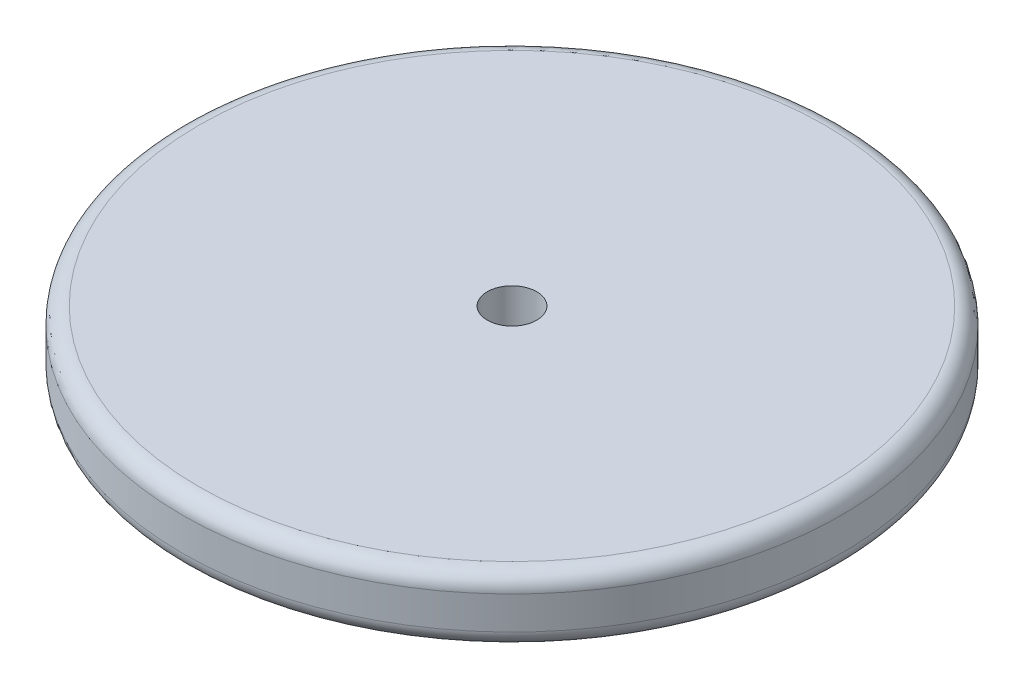
ISO-10303-21;
HEADER;
FILE_DESCRIPTION(('STEP AP214'),'2;1');
FILE_NAME('part.step','',(''),(''),'','','');
FILE_SCHEMA(('AUTOMOTIVE_DESIGN { 1 0 10303 214 1 1 1 1 }'));
ENDSEC;
DATA;
#1=APPLICATION_CONTEXT('core data for automotive mechanical design processes');
#2=APPLICATION_PROTOCOL_DEFINITION('international standard','automotive_design',2000,#1);
#3=PRODUCT_CONTEXT('',#1,'mechanical');
#4=PRODUCT('Part','Part','',(#3));
#5=PRODUCT_RELATED_PRODUCT_CATEGORY('part','',(#4));
#6=PRODUCT_DEFINITION_FORMATION('','',#4);
#7=PRODUCT_DEFINITION_CONTEXT('part definition',#1,'design');
#8=PRODUCT_DEFINITION('design','',#6,#7);
#9=PRODUCT_DEFINITION_SHAPE('','',#8);
#10=(LENGTH_UNIT() NAMED_UNIT(*) SI_UNIT(.MILLI.,.METRE.));
#11=(NAMED_UNIT(*) PLANE_ANGLE_UNIT() SI_UNIT($,.RADIAN.));
#12=(NAMED_UNIT(*) SI_UNIT($,.STERADIAN.) SOLID_ANGLE_UNIT());
#13=UNCERTAINTY_MEASURE_WITH_UNIT(LENGTH_MEASURE(1.E-05),#10,'distance_accuracy_value','');
#14=(GEOMETRIC_REPRESENTATION_CONTEXT(3) GLOBAL_UNCERTAINTY_ASSIGNED_CONTEXT((#13)) GLOBAL_UNIT_ASSIGNED_CONTEXT((#10,
#11,#12)) REPRESENTATION_CONTEXT('',''));
#15=CARTESIAN_POINT('',(0.,0.,0.));
#16=DIRECTION('',(0.,0.,1.));
#17=DIRECTION('',(1.,0.,0.));
#18=AXIS2_PLACEMENT_3D('',#15,#16,#17);
#19=CARTESIAN_POINT('',(0.,20.,0.));
#20=DIRECTION('',(0.,1.,0.));
#21=DIRECTION('',(0.,0.,1.));
#22=AXIS2_PLACEMENT_3D('',#19,#20,#21);
#23=PLANE('',#22);
#24=CARTESIAN_POINT('',(0.,20.,0.));
#25=DIRECTION('',(0.,1.,0.));
#26=DIRECTION('',(0.,0.,1.));
#27=AXIS2_PLACEMENT_3D('',#24,#25,#26);
#28=CIRCLE('',#27,95.);
#29=CARTESIAN_POINT('',(0.,20.,95.));
#30=VERTEX_POINT('',#29);
#31=EDGE_CURVE('E10',#30,#30,#28,.T.);
#32=ORIENTED_EDGE('',*,*,#31,.T.);
#33=EDGE_LOOP('',(#32));
#34=FACE_BOUND('',#33,.T.);
#35=CARTESIAN_POINT('',(0.,20.,0.));
#36=DIRECTION('',(0.,1.,0.));
#37=DIRECTION('',(0.,0.,1.));
#38=AXIS2_PLACEMENT_3D('',#35,#36,#37);
#39=CIRCLE('',#38,7.5);
#40=CARTESIAN_POINT('',(0.,20.,7.5));
#41=VERTEX_POINT('',#40);
#42=EDGE_CURVE('E53',#41,#41,#39,.T.);
#43=ORIENTED_EDGE('',*,*,#42,.F.);
#44=EDGE_LOOP('',(#43));
#45=FACE_BOUND('',#44,.T.);
#46=ADVANCED_FACE('F33',(#34,#45),#23,.T.);
#47=CARTESIAN_POINT('',(0.,0.,0.));
#48=DIRECTION('',(0.,1.,0.));
#49=DIRECTION('',(0.,0.,1.));
#50=AXIS2_PLACEMENT_3D('',#47,#48,#49);
#51=PLANE('',#50);
#52=CARTESIAN_POINT('',(0.,0.,0.));
#53=DIRECTION('',(0.,1.,0.));
#54=DIRECTION('',(0.,0.,1.));
#55=AXIS2_PLACEMENT_3D('',#52,#53,#54);
#56=CIRCLE('',#55,95.);
#57=CARTESIAN_POINT('',(0.,0.,95.));
#58=VERTEX_POINT('',#57);
#59=EDGE_CURVE('E40',#58,#58,#56,.F.);
#60=ORIENTED_EDGE('',*,*,#59,.T.);
#61=EDGE_LOOP('',(#60));
#62=FACE_BOUND('',#61,.T.);
#63=CARTESIAN_POINT('',(0.,0.,0.));
#64=DIRECTION('',(0.,1.,0.));
#65=DIRECTION('',(0.,0.,1.));
#66=AXIS2_PLACEMENT_3D('',#63,#64,#65);
#67=CIRCLE('',#66,7.5);
#68=CARTESIAN_POINT('',(0.,0.,7.5));
#69=VERTEX_POINT('',#68);
#70=EDGE_CURVE('E54',#69,#69,#67,.T.);
#71=ORIENTED_EDGE('',*,*,#70,.T.);
#72=EDGE_LOOP('',(#71));
#73=FACE_BOUND('',#72,.T.);
#74=ADVANCED_FACE('F64',(#62,#73),#51,.F.);
#75=CARTESIAN_POINT('',(0.,20.,0.));
#76=DIRECTION('',(0.,-1.,0.));
#77=DIRECTION('',(0.,0.,-1.));
#78=AXIS2_PLACEMENT_3D('',#75,#76,#77);
#79=CYLINDRICAL_SURFACE('',#78,100.);
#80=CARTESIAN_POINT('',(0.,5.,0.));
#81=DIRECTION('',(0.,1.,0.));
#82=DIRECTION('',(0.,0.,1.));
#83=AXIS2_PLACEMENT_3D('',#80,#81,#82);
#84=CIRCLE('',#83,100.);
#85=CARTESIAN_POINT('',(0.,5.,100.));
#86=VERTEX_POINT('',#85);
#87=EDGE_CURVE('E44',#86,#86,#84,.T.);
#88=ORIENTED_EDGE('',*,*,#87,.T.);
#89=EDGE_LOOP('',(#88));
#90=FACE_BOUND('',#89,.T.);
#91=CARTESIAN_POINT('',(0.,15.,0.));
#92=DIRECTION('',(0.,1.,0.));
#93=DIRECTION('',(0.,0.,1.));
#94=AXIS2_PLACEMENT_3D('',#91,#92,#93);
#95=CIRCLE('',#94,100.);
#96=CARTESIAN_POINT('',(0.,15.,100.));
#97=VERTEX_POINT('',#96);
#98=EDGE_CURVE('E48',#97,#97,#95,.F.);
#99=ORIENTED_EDGE('',*,*,#98,.T.);
#100=EDGE_LOOP('',(#99));
#101=FACE_BOUND('',#100,.T.);
#102=ADVANCED_FACE('F69',(#90,#101),#79,.T.);
#103=CARTESIAN_POINT('',(0.,20.,0.));
#104=DIRECTION('',(0.,-1.,0.));
#105=DIRECTION('',(0.,0.,-1.));
#106=AXIS2_PLACEMENT_3D('',#103,#104,#105);
#107=CYLINDRICAL_SURFACE('',#106,7.5);
#108=ORIENTED_EDGE('',*,*,#42,.T.);
#109=EDGE_LOOP('',(#108));
#110=FACE_BOUND('',#109,.T.);
#111=ORIENTED_EDGE('',*,*,#70,.F.);
#112=EDGE_LOOP('',(#111));
#113=FACE_BOUND('',#112,.T.);
#114=ADVANCED_FACE('F60',(#110,#113),#107,.F.);
#115=CARTESIAN_POINT('',(0.,5.,0.));
#116=DIRECTION('',(0.,1.,0.));
#117=DIRECTION('',(0.,0.,1.));
#118=AXIS2_PLACEMENT_3D('',#115,#116,#117);
#119=TOROIDAL_SURFACE('',#118,95.,5.);
#120=ORIENTED_EDGE('',*,*,#59,.F.);
#121=EDGE_LOOP('',(#120));
#122=FACE_BOUND('',#121,.T.);
#123=ORIENTED_EDGE('',*,*,#87,.F.);
#124=EDGE_LOOP('',(#123));
#125=FACE_BOUND('',#124,.T.);
#126=ADVANCED_FACE('F75',(#122,#125),#119,.T.);
#127=CARTESIAN_POINT('',(0.,15.,0.));
#128=DIRECTION('',(0.,1.,0.));
#129=DIRECTION('',(0.,0.,1.));
#130=AXIS2_PLACEMENT_3D('',#127,#128,#129);
#131=TOROIDAL_SURFACE('',#130,95.,5.);
#132=ORIENTED_EDGE('',*,*,#98,.F.);
#133=EDGE_LOOP('',(#132));
#134=FACE_BOUND('',#133,.T.);
#135=ORIENTED_EDGE('',*,*,#31,.F.);
#136=EDGE_LOOP('',(#135));
#137=FACE_BOUND('',#136,.T.);
#138=ADVANCED_FACE('F35',(#134,#137),#131,.T.);
#139=CLOSED_SHELL('',(#46,#74,#102,#114,#126,#138));
#140=MANIFOLD_SOLID_BREP('B2',#139);
#141=ADVANCED_BREP_SHAPE_REPRESENTATION('',(#18,#140),#14);
#142=SHAPE_DEFINITION_REPRESENTATION(#9,#141);
ENDSEC;
END-ISO-10303-21;
